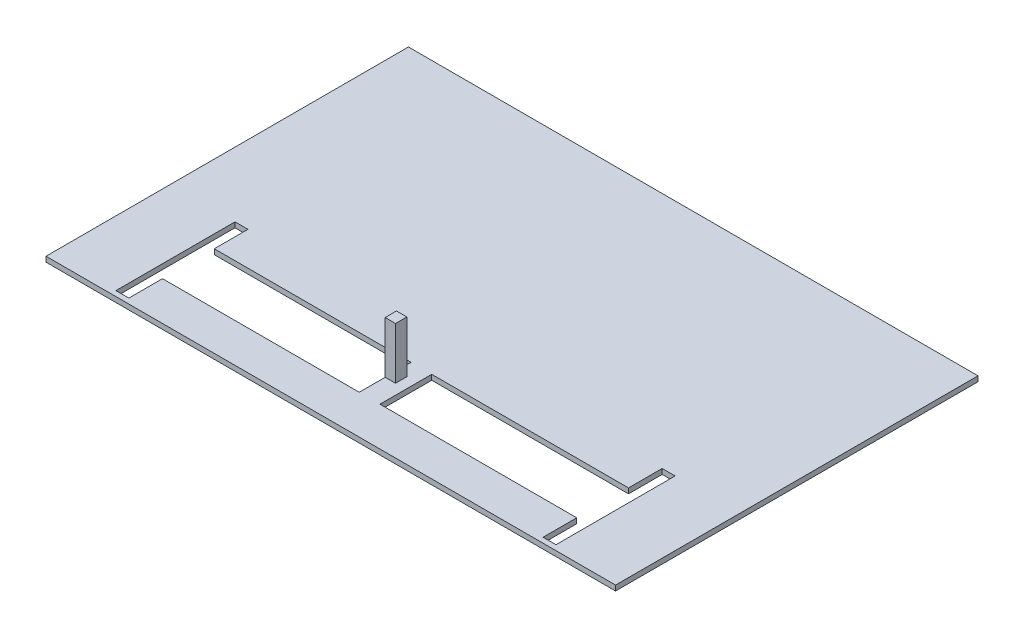
ISO-10303-21;
HEADER;
FILE_DESCRIPTION(('STEP AP214'),'2;1');
FILE_NAME('part.step','',(''),(''),'','','');
FILE_SCHEMA(('AUTOMOTIVE_DESIGN { 1 0 10303 214 1 1 1 1 }'));
ENDSEC;
DATA;
#1=APPLICATION_CONTEXT('core data for automotive mechanical design processes');
#2=APPLICATION_PROTOCOL_DEFINITION('international standard','automotive_design',2000,#1);
#3=PRODUCT_CONTEXT('',#1,'mechanical');
#4=PRODUCT('Part','Part','',(#3));
#5=PRODUCT_RELATED_PRODUCT_CATEGORY('part','',(#4));
#6=PRODUCT_DEFINITION_FORMATION('','',#4);
#7=PRODUCT_DEFINITION_CONTEXT('part definition',#1,'design');
#8=PRODUCT_DEFINITION('design','',#6,#7);
#9=PRODUCT_DEFINITION_SHAPE('','',#8);
#10=(LENGTH_UNIT() NAMED_UNIT(*) SI_UNIT(.MILLI.,.METRE.));
#11=(NAMED_UNIT(*) PLANE_ANGLE_UNIT() SI_UNIT($,.RADIAN.));
#12=(NAMED_UNIT(*) SI_UNIT($,.STERADIAN.) SOLID_ANGLE_UNIT());
#13=UNCERTAINTY_MEASURE_WITH_UNIT(LENGTH_MEASURE(1.E-05),#10,'distance_accuracy_value','');
#14=(GEOMETRIC_REPRESENTATION_CONTEXT(3) GLOBAL_UNCERTAINTY_ASSIGNED_CONTEXT((#13)) GLOBAL_UNIT_ASSIGNED_CONTEXT((#10,
#11,#12)) REPRESENTATION_CONTEXT('',''));
#15=CARTESIAN_POINT('',(0.,0.,0.));
#16=DIRECTION('',(0.,0.,1.));
#17=DIRECTION('',(1.,0.,0.));
#18=AXIS2_PLACEMENT_3D('',#15,#16,#17);
#19=CARTESIAN_POINT('',(80.,2.,35.));
#20=DIRECTION('',(0.,0.,1.));
#21=DIRECTION('',(1.,0.,0.));
#22=AXIS2_PLACEMENT_3D('',#19,#20,#21);
#23=PLANE('',#22);
#24=DIRECTION('',(-1.,0.,0.));
#25=VECTOR('',#24,1.);
#26=CARTESIAN_POINT('',(80.,0.,35.));
#27=LINE('',#26,#25);
#28=CARTESIAN_POINT('',(-3.99999999999999,0.,35.));
#29=VERTEX_POINT('',#28);
#30=CARTESIAN_POINT('',(-80.,0.,35.));
#31=VERTEX_POINT('',#30);
#32=EDGE_CURVE('E240',#29,#31,#27,.T.);
#33=ORIENTED_EDGE('',*,*,#32,.F.);
#34=DIRECTION('',(0.,-1.,0.));
#35=VECTOR('',#34,1.);
#36=CARTESIAN_POINT('',(-3.99999999999999,2.,35.0000000000001));
#37=LINE('',#36,#35);
#38=CARTESIAN_POINT('',(-3.99999999999999,2.,35.0000000000001));
#39=VERTEX_POINT('',#38);
#40=EDGE_CURVE('E226',#39,#29,#37,.T.);
#41=ORIENTED_EDGE('',*,*,#40,.F.);
#42=DIRECTION('',(-1.,0.,0.));
#43=VECTOR('',#42,1.);
#44=CARTESIAN_POINT('',(80.,2.,35.));
#45=LINE('',#44,#43);
#46=CARTESIAN_POINT('',(-80.,2.,35.));
#47=VERTEX_POINT('',#46);
#48=EDGE_CURVE('E245',#39,#47,#45,.T.);
#49=ORIENTED_EDGE('',*,*,#48,.T.);
#50=DIRECTION('',(0.,-1.,0.));
#51=VECTOR('',#50,1.);
#52=CARTESIAN_POINT('',(-80.,2.,35.));
#53=LINE('',#52,#51);
#54=EDGE_CURVE('E331',#47,#31,#53,.T.);
#55=ORIENTED_EDGE('',*,*,#54,.T.);
#56=EDGE_LOOP('',(#33,#41,#49,#55));
#57=FACE_BOUND('',#56,.T.);
#58=ADVANCED_FACE('F33',(#57),#23,.T.);
#59=CARTESIAN_POINT('',(80.,2.,35.));
#60=VERTEX_POINT('',#59);
#61=CARTESIAN_POINT('',(4.00000000000001,2.,35.0000000000001));
#62=VERTEX_POINT('',#61);
#63=EDGE_CURVE('E241',#60,#62,#45,.T.);
#64=ORIENTED_EDGE('',*,*,#63,.T.);
#65=DIRECTION('',(0.,-1.,0.));
#66=VECTOR('',#65,1.);
#67=CARTESIAN_POINT('',(4.00000000000001,2.,35.0000000000001));
#68=LINE('',#67,#66);
#69=CARTESIAN_POINT('',(4.00000000000001,0.,35.0000000000001));
#70=VERTEX_POINT('',#69);
#71=EDGE_CURVE('E231',#62,#70,#68,.T.);
#72=ORIENTED_EDGE('',*,*,#71,.T.);
#73=CARTESIAN_POINT('',(80.,0.,35.));
#74=VERTEX_POINT('',#73);
#75=EDGE_CURVE('E271',#74,#70,#27,.T.);
#76=ORIENTED_EDGE('',*,*,#75,.F.);
#77=DIRECTION('',(0.,-1.,0.));
#78=VECTOR('',#77,1.);
#79=CARTESIAN_POINT('',(80.,2.,35.));
#80=LINE('',#79,#78);
#81=EDGE_CURVE('E270',#60,#74,#80,.T.);
#82=ORIENTED_EDGE('',*,*,#81,.F.);
#83=EDGE_LOOP('',(#64,#72,#76,#82));
#84=FACE_BOUND('',#83,.T.);
#85=ADVANCED_FACE('F388',(#84),#23,.T.);
#86=CARTESIAN_POINT('',(80.,2.,55.));
#87=DIRECTION('',(0.,0.,-1.));
#88=DIRECTION('',(-1.,0.,0.));
#89=AXIS2_PLACEMENT_3D('',#86,#87,#88);
#90=PLANE('',#89);
#91=DIRECTION('',(1.,0.,0.));
#92=VECTOR('',#91,1.);
#93=CARTESIAN_POINT('',(80.,2.,55.));
#94=LINE('',#93,#92);
#95=CARTESIAN_POINT('',(-80.,2.,55.));
#96=VERTEX_POINT('',#95);
#97=CARTESIAN_POINT('',(-3.99999999999999,2.,55.0000000000001));
#98=VERTEX_POINT('',#97);
#99=EDGE_CURVE('E256',#96,#98,#94,.T.);
#100=ORIENTED_EDGE('',*,*,#99,.T.);
#101=DIRECTION('',(0.,-1.,0.));
#102=VECTOR('',#101,1.);
#103=CARTESIAN_POINT('',(-3.99999999999999,2.,55.0000000000001));
#104=LINE('',#103,#102);
#105=CARTESIAN_POINT('',(-3.99999999999999,0.,55.0000000000001));
#106=VERTEX_POINT('',#105);
#107=EDGE_CURVE('E237',#98,#106,#104,.T.);
#108=ORIENTED_EDGE('',*,*,#107,.T.);
#109=DIRECTION('',(1.,0.,0.));
#110=VECTOR('',#109,1.);
#111=CARTESIAN_POINT('',(80.,0.,55.));
#112=LINE('',#111,#110);
#113=CARTESIAN_POINT('',(-80.,0.,55.));
#114=VERTEX_POINT('',#113);
#115=EDGE_CURVE('E290',#114,#106,#112,.T.);
#116=ORIENTED_EDGE('',*,*,#115,.F.);
#117=DIRECTION('',(0.,-1.,0.));
#118=VECTOR('',#117,1.);
#119=CARTESIAN_POINT('',(-80.,2.,55.));
#120=LINE('',#119,#118);
#121=EDGE_CURVE('E321',#96,#114,#120,.T.);
#122=ORIENTED_EDGE('',*,*,#121,.F.);
#123=EDGE_LOOP('',(#100,#108,#116,#122));
#124=FACE_BOUND('',#123,.T.);
#125=ADVANCED_FACE('F395',(#124),#90,.T.);
#126=CARTESIAN_POINT('',(4.,0.,55.));
#127=VERTEX_POINT('',#126);
#128=CARTESIAN_POINT('',(80.,0.,55.));
#129=VERTEX_POINT('',#128);
#130=EDGE_CURVE('E289',#127,#129,#112,.T.);
#131=ORIENTED_EDGE('',*,*,#130,.F.);
#132=DIRECTION('',(0.,-1.,0.));
#133=VECTOR('',#132,1.);
#134=CARTESIAN_POINT('',(4.00000000000001,2.,55.0000000000001));
#135=LINE('',#134,#133);
#136=CARTESIAN_POINT('',(4.00000000000001,2.,55.0000000000001));
#137=VERTEX_POINT('',#136);
#138=EDGE_CURVE('E234',#137,#127,#135,.T.);
#139=ORIENTED_EDGE('',*,*,#138,.F.);
#140=CARTESIAN_POINT('',(80.,2.,55.));
#141=VERTEX_POINT('',#140);
#142=EDGE_CURVE('E255',#137,#141,#94,.T.);
#143=ORIENTED_EDGE('',*,*,#142,.T.);
#144=DIRECTION('',(0.,-1.,0.));
#145=VECTOR('',#144,1.);
#146=CARTESIAN_POINT('',(80.,2.,55.));
#147=LINE('',#146,#145);
#148=EDGE_CURVE('E318',#141,#129,#147,.T.);
#149=ORIENTED_EDGE('',*,*,#148,.T.);
#150=EDGE_LOOP('',(#131,#139,#143,#149));
#151=FACE_BOUND('',#150,.T.);
#152=ADVANCED_FACE('F404',(#151),#90,.T.);
#153=CARTESIAN_POINT('',(0.,2.,0.));
#154=DIRECTION('',(0.,1.,0.));
#155=DIRECTION('',(0.,0.,1.));
#156=AXIS2_PLACEMENT_3D('',#153,#154,#155);
#157=PLANE('',#156);
#158=DIRECTION('',(1.,0.,0.));
#159=VECTOR('',#158,1.);
#160=CARTESIAN_POINT('',(0.,2.,45.0000000000001));
#161=LINE('',#160,#159);
#162=CARTESIAN_POINT('',(-3.99999999999999,2.,45.0000000000001));
#163=VERTEX_POINT('',#162);
#164=CARTESIAN_POINT('',(0.,2.,45.0000000000001));
#165=VERTEX_POINT('',#164);
#166=EDGE_CURVE('E211',#163,#165,#161,.T.);
#167=ORIENTED_EDGE('',*,*,#166,.F.);
#168=DIRECTION('',(0.,0.,1.));
#169=VECTOR('',#168,1.);
#170=CARTESIAN_POINT('',(-3.99999999999999,2.,55.0000000000001));
#171=LINE('',#170,#169);
#172=EDGE_CURVE('E225',#163,#98,#171,.T.);
#173=ORIENTED_EDGE('',*,*,#172,.T.);
#174=ORIENTED_EDGE('',*,*,#99,.F.);
#175=DIRECTION('',(0.,0.,-1.));
#176=VECTOR('',#175,1.);
#177=CARTESIAN_POINT('',(-80.,2.,55.));
#178=LINE('',#177,#176);
#179=CARTESIAN_POINT('',(-80.,2.,68.));
#180=VERTEX_POINT('',#179);
#181=EDGE_CURVE('E253',#180,#96,#178,.T.);
#182=ORIENTED_EDGE('',*,*,#181,.F.);
#183=DIRECTION('',(1.,0.,0.));
#184=VECTOR('',#183,1.);
#185=CARTESIAN_POINT('',(-80.,2.,68.));
#186=LINE('',#185,#184);
#187=CARTESIAN_POINT('',(-85.,2.,68.));
#188=VERTEX_POINT('',#187);
#189=EDGE_CURVE('E251',#188,#180,#186,.T.);
#190=ORIENTED_EDGE('',*,*,#189,.F.);
#191=DIRECTION('',(0.,0.,1.));
#192=VECTOR('',#191,1.);
#193=CARTESIAN_POINT('',(-85.,2.,22.));
#194=LINE('',#193,#192);
#195=CARTESIAN_POINT('',(-85.,2.,22.));
#196=VERTEX_POINT('',#195);
#197=EDGE_CURVE('E249',#196,#188,#194,.T.);
#198=ORIENTED_EDGE('',*,*,#197,.F.);
#199=DIRECTION('',(-1.,0.,0.));
#200=VECTOR('',#199,1.);
#201=CARTESIAN_POINT('',(-80.,2.,22.));
#202=LINE('',#201,#200);
#203=CARTESIAN_POINT('',(-80.,2.,22.));
#204=VERTEX_POINT('',#203);
#205=EDGE_CURVE('E247',#204,#196,#202,.T.);
#206=ORIENTED_EDGE('',*,*,#205,.F.);
#207=DIRECTION('',(0.,0.,-1.));
#208=VECTOR('',#207,1.);
#209=CARTESIAN_POINT('',(-80.,2.,35.));
#210=LINE('',#209,#208);
#211=EDGE_CURVE('E244',#47,#204,#210,.T.);
#212=ORIENTED_EDGE('',*,*,#211,.F.);
#213=ORIENTED_EDGE('',*,*,#48,.F.);
#214=CARTESIAN_POINT('',(-3.99999999999999,2.,40.6187513861027));
#215=VERTEX_POINT('',#214);
#216=EDGE_CURVE('E222',#39,#215,#171,.T.);
#217=ORIENTED_EDGE('',*,*,#216,.T.);
#218=DIRECTION('',(-1.,0.,0.));
#219=VECTOR('',#218,1.);
#220=CARTESIAN_POINT('',(0.,2.,40.6187513861027));
#221=LINE('',#220,#219);
#222=CARTESIAN_POINT('',(0.,2.,40.6187513861027));
#223=VERTEX_POINT('',#222);
#224=EDGE_CURVE('E53',#223,#215,#221,.T.);
#225=ORIENTED_EDGE('',*,*,#224,.F.);
#226=DIRECTION('',(0.,0.,-1.));
#227=VECTOR('',#226,1.);
#228=CARTESIAN_POINT('',(0.,2.,45.0000000000001));
#229=LINE('',#228,#227);
#230=EDGE_CURVE('E48',#165,#223,#229,.T.);
#231=ORIENTED_EDGE('',*,*,#230,.F.);
#232=EDGE_LOOP('',(#167,#173,#174,#182,#190,#198,#206,#212,#213,#217,#225,#231));
#233=FACE_BOUND('',#232,.T.);
#234=DIRECTION('',(0.,0.,1.));
#235=VECTOR('',#234,1.);
#236=CARTESIAN_POINT('',(-110.,2.,70.0000000000001));
#237=LINE('',#236,#235);
#238=CARTESIAN_POINT('',(-110.,2.,-69.9999999999999));
#239=VERTEX_POINT('',#238);
#240=CARTESIAN_POINT('',(-110.,2.,70.0000000000001));
#241=VERTEX_POINT('',#240);
#242=EDGE_CURVE('E335',#239,#241,#237,.T.);
#243=ORIENTED_EDGE('',*,*,#242,.T.);
#244=DIRECTION('',(1.,0.,0.));
#245=VECTOR('',#244,1.);
#246=CARTESIAN_POINT('',(110.,2.,70.0000000000001));
#247=LINE('',#246,#245);
#248=CARTESIAN_POINT('',(110.,2.,70.0000000000001));
#249=VERTEX_POINT('',#248);
#250=EDGE_CURVE('E338',#241,#249,#247,.T.);
#251=ORIENTED_EDGE('',*,*,#250,.T.);
#252=DIRECTION('',(0.,0.,-1.));
#253=VECTOR('',#252,1.);
#254=CARTESIAN_POINT('',(110.,2.,70.0000000000001));
#255=LINE('',#254,#253);
#256=CARTESIAN_POINT('',(110.,2.,-70.));
#257=VERTEX_POINT('',#256);
#258=EDGE_CURVE('E341',#249,#257,#255,.T.);
#259=ORIENTED_EDGE('',*,*,#258,.T.);
#260=DIRECTION('',(-1.,0.,0.));
#261=VECTOR('',#260,1.);
#262=CARTESIAN_POINT('',(110.,2.,-70.));
#263=LINE('',#262,#261);
#264=EDGE_CURVE('E343',#257,#239,#263,.T.);
#265=ORIENTED_EDGE('',*,*,#264,.T.);
#266=EDGE_LOOP('',(#243,#251,#259,#265));
#267=FACE_BOUND('',#266,.T.);
#268=DIRECTION('',(0.,0.,-1.));
#269=VECTOR('',#268,1.);
#270=CARTESIAN_POINT('',(4.00000000000001,2.,55.0000000000001));
#271=LINE('',#270,#269);
#272=EDGE_CURVE('E224',#137,#62,#271,.T.);
#273=ORIENTED_EDGE('',*,*,#272,.T.);
#274=ORIENTED_EDGE('',*,*,#63,.F.);
#275=DIRECTION('',(0.,0.,1.));
#276=VECTOR('',#275,1.);
#277=CARTESIAN_POINT('',(80.,2.,35.));
#278=LINE('',#277,#276);
#279=CARTESIAN_POINT('',(80.0000000000001,2.,22.));
#280=VERTEX_POINT('',#279);
#281=EDGE_CURVE('E268',#280,#60,#278,.T.);
#282=ORIENTED_EDGE('',*,*,#281,.F.);
#283=DIRECTION('',(-1.,0.,0.));
#284=VECTOR('',#283,1.);
#285=CARTESIAN_POINT('',(80.0000000000001,2.,22.));
#286=LINE('',#285,#284);
#287=CARTESIAN_POINT('',(85.0000000000001,2.,22.));
#288=VERTEX_POINT('',#287);
#289=EDGE_CURVE('E265',#288,#280,#286,.T.);
#290=ORIENTED_EDGE('',*,*,#289,.F.);
#291=DIRECTION('',(0.,0.,-1.));
#292=VECTOR('',#291,1.);
#293=CARTESIAN_POINT('',(85.0000000000001,2.,22.));
#294=LINE('',#293,#292);
#295=CARTESIAN_POINT('',(85.0000000000001,2.,68.));
#296=VERTEX_POINT('',#295);
#297=EDGE_CURVE('E263',#296,#288,#294,.T.);
#298=ORIENTED_EDGE('',*,*,#297,.F.);
#299=DIRECTION('',(1.,0.,0.));
#300=VECTOR('',#299,1.);
#301=CARTESIAN_POINT('',(80.0000000000001,2.,68.));
#302=LINE('',#301,#300);
#303=CARTESIAN_POINT('',(80.0000000000001,2.,68.));
#304=VERTEX_POINT('',#303);
#305=EDGE_CURVE('E261',#304,#296,#302,.T.);
#306=ORIENTED_EDGE('',*,*,#305,.F.);
#307=DIRECTION('',(0.,0.,1.));
#308=VECTOR('',#307,1.);
#309=CARTESIAN_POINT('',(80.,2.,55.));
#310=LINE('',#309,#308);
#311=EDGE_CURVE('E259',#141,#304,#310,.T.);
#312=ORIENTED_EDGE('',*,*,#311,.F.);
#313=ORIENTED_EDGE('',*,*,#142,.F.);
#314=EDGE_LOOP('',(#273,#274,#282,#290,#298,#306,#312,#313));
#315=FACE_BOUND('',#314,.T.);
#316=ADVANCED_FACE('F378',(#233,#267,#315),#157,.T.);
#317=CARTESIAN_POINT('',(0.,0.,0.));
#318=DIRECTION('',(0.,1.,0.));
#319=DIRECTION('',(0.,0.,1.));
#320=AXIS2_PLACEMENT_3D('',#317,#318,#319);
#321=PLANE('',#320);
#322=DIRECTION('',(0.,0.,1.));
#323=VECTOR('',#322,1.);
#324=CARTESIAN_POINT('',(-3.99999999999999,0.,55.0000000000001));
#325=LINE('',#324,#323);
#326=EDGE_CURVE('E214',#29,#106,#325,.T.);
#327=ORIENTED_EDGE('',*,*,#326,.F.);
#328=ORIENTED_EDGE('',*,*,#32,.T.);
#329=DIRECTION('',(0.,0.,-1.));
#330=VECTOR('',#329,1.);
#331=CARTESIAN_POINT('',(-80.,0.,35.));
#332=LINE('',#331,#330);
#333=CARTESIAN_POINT('',(-80.,0.,22.));
#334=VERTEX_POINT('',#333);
#335=EDGE_CURVE('E274',#31,#334,#332,.T.);
#336=ORIENTED_EDGE('',*,*,#335,.T.);
#337=DIRECTION('',(-1.,0.,0.));
#338=VECTOR('',#337,1.);
#339=CARTESIAN_POINT('',(-80.,0.,22.));
#340=LINE('',#339,#338);
#341=CARTESIAN_POINT('',(-85.,0.,22.));
#342=VERTEX_POINT('',#341);
#343=EDGE_CURVE('E277',#334,#342,#340,.T.);
#344=ORIENTED_EDGE('',*,*,#343,.T.);
#345=DIRECTION('',(0.,0.,1.));
#346=VECTOR('',#345,1.);
#347=CARTESIAN_POINT('',(-85.,0.,22.));
#348=LINE('',#347,#346);
#349=CARTESIAN_POINT('',(-85.,0.,68.));
#350=VERTEX_POINT('',#349);
#351=EDGE_CURVE('E280',#342,#350,#348,.T.);
#352=ORIENTED_EDGE('',*,*,#351,.T.);
#353=DIRECTION('',(1.,0.,0.));
#354=VECTOR('',#353,1.);
#355=CARTESIAN_POINT('',(-80.,0.,68.));
#356=LINE('',#355,#354);
#357=CARTESIAN_POINT('',(-80.,0.,68.));
#358=VERTEX_POINT('',#357);
#359=EDGE_CURVE('E283',#350,#358,#356,.T.);
#360=ORIENTED_EDGE('',*,*,#359,.T.);
#361=DIRECTION('',(0.,0.,-1.));
#362=VECTOR('',#361,1.);
#363=CARTESIAN_POINT('',(-80.,0.,55.));
#364=LINE('',#363,#362);
#365=EDGE_CURVE('E286',#358,#114,#364,.T.);
#366=ORIENTED_EDGE('',*,*,#365,.T.);
#367=ORIENTED_EDGE('',*,*,#115,.T.);
#368=EDGE_LOOP('',(#327,#328,#336,#344,#352,#360,#366,#367));
#369=FACE_BOUND('',#368,.T.);
#370=DIRECTION('',(0.,0.,1.));
#371=VECTOR('',#370,1.);
#372=CARTESIAN_POINT('',(-110.,0.,70.0000000000001));
#373=LINE('',#372,#371);
#374=CARTESIAN_POINT('',(-110.,0.,-69.9999999999999));
#375=VERTEX_POINT('',#374);
#376=CARTESIAN_POINT('',(-110.,0.,70.0000000000001));
#377=VERTEX_POINT('',#376);
#378=EDGE_CURVE('E334',#375,#377,#373,.T.);
#379=ORIENTED_EDGE('',*,*,#378,.F.);
#380=DIRECTION('',(-1.,0.,0.));
#381=VECTOR('',#380,1.);
#382=CARTESIAN_POINT('',(110.,0.,-70.));
#383=LINE('',#382,#381);
#384=CARTESIAN_POINT('',(110.,0.,-70.));
#385=VERTEX_POINT('',#384);
#386=EDGE_CURVE('E339',#385,#375,#383,.T.);
#387=ORIENTED_EDGE('',*,*,#386,.F.);
#388=DIRECTION('',(0.,0.,-1.));
#389=VECTOR('',#388,1.);
#390=CARTESIAN_POINT('',(110.,0.,70.0000000000001));
#391=LINE('',#390,#389);
#392=CARTESIAN_POINT('',(110.,0.,70.0000000000001));
#393=VERTEX_POINT('',#392);
#394=EDGE_CURVE('E350',#393,#385,#391,.T.);
#395=ORIENTED_EDGE('',*,*,#394,.F.);
#396=DIRECTION('',(1.,0.,0.));
#397=VECTOR('',#396,1.);
#398=CARTESIAN_POINT('',(110.,0.,70.0000000000001));
#399=LINE('',#398,#397);
#400=EDGE_CURVE('E348',#377,#393,#399,.T.);
#401=ORIENTED_EDGE('',*,*,#400,.F.);
#402=EDGE_LOOP('',(#379,#387,#395,#401));
#403=FACE_BOUND('',#402,.T.);
#404=ORIENTED_EDGE('',*,*,#75,.T.);
#405=DIRECTION('',(0.,0.,-1.));
#406=VECTOR('',#405,1.);
#407=CARTESIAN_POINT('',(4.00000000000001,0.,55.0000000000001));
#408=LINE('',#407,#406);
#409=EDGE_CURVE('E216',#127,#70,#408,.T.);
#410=ORIENTED_EDGE('',*,*,#409,.F.);
#411=ORIENTED_EDGE('',*,*,#130,.T.);
#412=DIRECTION('',(0.,0.,1.));
#413=VECTOR('',#412,1.);
#414=CARTESIAN_POINT('',(80.,0.,55.));
#415=LINE('',#414,#413);
#416=CARTESIAN_POINT('',(80.0000000000001,0.,68.));
#417=VERTEX_POINT('',#416);
#418=EDGE_CURVE('E293',#129,#417,#415,.T.);
#419=ORIENTED_EDGE('',*,*,#418,.T.);
#420=DIRECTION('',(1.,0.,0.));
#421=VECTOR('',#420,1.);
#422=CARTESIAN_POINT('',(80.0000000000001,0.,68.));
#423=LINE('',#422,#421);
#424=CARTESIAN_POINT('',(85.0000000000001,0.,68.));
#425=VERTEX_POINT('',#424);
#426=EDGE_CURVE('E296',#417,#425,#423,.T.);
#427=ORIENTED_EDGE('',*,*,#426,.T.);
#428=DIRECTION('',(0.,0.,-1.));
#429=VECTOR('',#428,1.);
#430=CARTESIAN_POINT('',(85.0000000000001,0.,22.));
#431=LINE('',#430,#429);
#432=CARTESIAN_POINT('',(85.0000000000001,0.,22.));
#433=VERTEX_POINT('',#432);
#434=EDGE_CURVE('E299',#425,#433,#431,.T.);
#435=ORIENTED_EDGE('',*,*,#434,.T.);
#436=DIRECTION('',(-1.,0.,0.));
#437=VECTOR('',#436,1.);
#438=CARTESIAN_POINT('',(80.0000000000001,0.,22.));
#439=LINE('',#438,#437);
#440=CARTESIAN_POINT('',(80.0000000000001,0.,22.));
#441=VERTEX_POINT('',#440);
#442=EDGE_CURVE('E302',#433,#441,#439,.T.);
#443=ORIENTED_EDGE('',*,*,#442,.T.);
#444=DIRECTION('',(0.,0.,1.));
#445=VECTOR('',#444,1.);
#446=CARTESIAN_POINT('',(80.,0.,35.));
#447=LINE('',#446,#445);
#448=EDGE_CURVE('E305',#441,#74,#447,.T.);
#449=ORIENTED_EDGE('',*,*,#448,.T.);
#450=EDGE_LOOP('',(#404,#410,#411,#419,#427,#435,#443,#449));
#451=FACE_BOUND('',#450,.T.);
#452=ADVANCED_FACE('F368',(#369,#403,#451),#321,.F.);
#453=CARTESIAN_POINT('',(-110.,2.,70.0000000000001));
#454=DIRECTION('',(1.,0.,0.));
#455=DIRECTION('',(0.,0.,-1.));
#456=AXIS2_PLACEMENT_3D('',#453,#454,#455);
#457=PLANE('',#456);
#458=ORIENTED_EDGE('',*,*,#378,.T.);
#459=DIRECTION('',(0.,-1.,0.));
#460=VECTOR('',#459,1.);
#461=CARTESIAN_POINT('',(-110.,2.,70.0000000000001));
#462=LINE('',#461,#460);
#463=EDGE_CURVE('E11',#241,#377,#462,.T.);
#464=ORIENTED_EDGE('',*,*,#463,.F.);
#465=ORIENTED_EDGE('',*,*,#242,.F.);
#466=DIRECTION('',(0.,-1.,0.));
#467=VECTOR('',#466,1.);
#468=CARTESIAN_POINT('',(-110.,2.,-69.9999999999999));
#469=LINE('',#468,#467);
#470=EDGE_CURVE('E345',#239,#375,#469,.T.);
#471=ORIENTED_EDGE('',*,*,#470,.T.);
#472=EDGE_LOOP('',(#458,#464,#465,#471));
#473=FACE_BOUND('',#472,.T.);
#474=ADVANCED_FACE('F35',(#473),#457,.F.);
#475=CARTESIAN_POINT('',(110.,2.,70.0000000000001));
#476=DIRECTION('',(0.,0.,-1.));
#477=DIRECTION('',(-1.,0.,0.));
#478=AXIS2_PLACEMENT_3D('',#475,#476,#477);
#479=PLANE('',#478);
#480=ORIENTED_EDGE('',*,*,#400,.T.);
#481=DIRECTION('',(0.,-1.,0.));
#482=VECTOR('',#481,1.);
#483=CARTESIAN_POINT('',(110.,2.,70.0000000000001));
#484=LINE('',#483,#482);
#485=EDGE_CURVE('E41',#249,#393,#484,.T.);
#486=ORIENTED_EDGE('',*,*,#485,.F.);
#487=ORIENTED_EDGE('',*,*,#250,.F.);
#488=ORIENTED_EDGE('',*,*,#463,.T.);
#489=EDGE_LOOP('',(#480,#486,#487,#488));
#490=FACE_BOUND('',#489,.T.);
#491=ADVANCED_FACE('F380',(#490),#479,.F.);
#492=CARTESIAN_POINT('',(110.,2.,70.0000000000001));
#493=DIRECTION('',(-1.,0.,0.));
#494=DIRECTION('',(0.,0.,1.));
#495=AXIS2_PLACEMENT_3D('',#492,#493,#494);
#496=PLANE('',#495);
#497=ORIENTED_EDGE('',*,*,#394,.T.);
#498=DIRECTION('',(0.,-1.,0.));
#499=VECTOR('',#498,1.);
#500=CARTESIAN_POINT('',(110.,2.,-70.));
#501=LINE('',#500,#499);
#502=EDGE_CURVE('E355',#257,#385,#501,.T.);
#503=ORIENTED_EDGE('',*,*,#502,.F.);
#504=ORIENTED_EDGE('',*,*,#258,.F.);
#505=ORIENTED_EDGE('',*,*,#485,.T.);
#506=EDGE_LOOP('',(#497,#503,#504,#505));
#507=FACE_BOUND('',#506,.T.);
#508=ADVANCED_FACE('F362',(#507),#496,.F.);
#509=CARTESIAN_POINT('',(110.,2.,-70.));
#510=DIRECTION('',(0.,0.,1.));
#511=DIRECTION('',(1.,0.,0.));
#512=AXIS2_PLACEMENT_3D('',#509,#510,#511);
#513=PLANE('',#512);
#514=ORIENTED_EDGE('',*,*,#386,.T.);
#515=ORIENTED_EDGE('',*,*,#470,.F.);
#516=ORIENTED_EDGE('',*,*,#264,.F.);
#517=ORIENTED_EDGE('',*,*,#502,.T.);
#518=EDGE_LOOP('',(#514,#515,#516,#517));
#519=FACE_BOUND('',#518,.T.);
#520=ADVANCED_FACE('F372',(#519),#513,.F.);
#521=CARTESIAN_POINT('',(-80.,2.,35.));
#522=DIRECTION('',(-1.,0.,0.));
#523=DIRECTION('',(0.,0.,1.));
#524=AXIS2_PLACEMENT_3D('',#521,#522,#523);
#525=PLANE('',#524);
#526=ORIENTED_EDGE('',*,*,#335,.F.);
#527=ORIENTED_EDGE('',*,*,#54,.F.);
#528=ORIENTED_EDGE('',*,*,#211,.T.);
#529=DIRECTION('',(0.,-1.,0.));
#530=VECTOR('',#529,1.);
#531=CARTESIAN_POINT('',(-80.,2.,22.));
#532=LINE('',#531,#530);
#533=EDGE_CURVE('E329',#204,#334,#532,.T.);
#534=ORIENTED_EDGE('',*,*,#533,.T.);
#535=EDGE_LOOP('',(#526,#527,#528,#534));
#536=FACE_BOUND('',#535,.T.);
#537=ADVANCED_FACE('F400',(#536),#525,.T.);
#538=CARTESIAN_POINT('',(-80.,2.,22.));
#539=DIRECTION('',(0.,0.,1.));
#540=DIRECTION('',(1.,0.,0.));
#541=AXIS2_PLACEMENT_3D('',#538,#539,#540);
#542=PLANE('',#541);
#543=ORIENTED_EDGE('',*,*,#343,.F.);
#544=ORIENTED_EDGE('',*,*,#533,.F.);
#545=ORIENTED_EDGE('',*,*,#205,.T.);
#546=DIRECTION('',(0.,-1.,0.));
#547=VECTOR('',#546,1.);
#548=CARTESIAN_POINT('',(-85.,2.,22.));
#549=LINE('',#548,#547);
#550=EDGE_CURVE('E327',#196,#342,#549,.T.);
#551=ORIENTED_EDGE('',*,*,#550,.T.);
#552=EDGE_LOOP('',(#543,#544,#545,#551));
#553=FACE_BOUND('',#552,.T.);
#554=ADVANCED_FACE('F412',(#553),#542,.T.);
#555=CARTESIAN_POINT('',(-85.,2.,22.));
#556=DIRECTION('',(1.,0.,0.));
#557=DIRECTION('',(0.,0.,-1.));
#558=AXIS2_PLACEMENT_3D('',#555,#556,#557);
#559=PLANE('',#558);
#560=ORIENTED_EDGE('',*,*,#351,.F.);
#561=ORIENTED_EDGE('',*,*,#550,.F.);
#562=ORIENTED_EDGE('',*,*,#197,.T.);
#563=DIRECTION('',(0.,-1.,0.));
#564=VECTOR('',#563,1.);
#565=CARTESIAN_POINT('',(-85.,2.,68.));
#566=LINE('',#565,#564);
#567=EDGE_CURVE('E325',#188,#350,#566,.T.);
#568=ORIENTED_EDGE('',*,*,#567,.T.);
#569=EDGE_LOOP('',(#560,#561,#562,#568));
#570=FACE_BOUND('',#569,.T.);
#571=ADVANCED_FACE('F417',(#570),#559,.T.);
#572=CARTESIAN_POINT('',(-80.,2.,68.));
#573=DIRECTION('',(0.,0.,-1.));
#574=DIRECTION('',(-1.,0.,0.));
#575=AXIS2_PLACEMENT_3D('',#572,#573,#574);
#576=PLANE('',#575);
#577=ORIENTED_EDGE('',*,*,#359,.F.);
#578=ORIENTED_EDGE('',*,*,#567,.F.);
#579=ORIENTED_EDGE('',*,*,#189,.T.);
#580=DIRECTION('',(0.,-1.,0.));
#581=VECTOR('',#580,1.);
#582=CARTESIAN_POINT('',(-80.,2.,68.));
#583=LINE('',#582,#581);
#584=EDGE_CURVE('E323',#180,#358,#583,.T.);
#585=ORIENTED_EDGE('',*,*,#584,.T.);
#586=EDGE_LOOP('',(#577,#578,#579,#585));
#587=FACE_BOUND('',#586,.T.);
#588=ADVANCED_FACE('F435',(#587),#576,.T.);
#589=CARTESIAN_POINT('',(-80.,2.,55.));
#590=DIRECTION('',(-1.,0.,0.));
#591=DIRECTION('',(0.,0.,1.));
#592=AXIS2_PLACEMENT_3D('',#589,#590,#591);
#593=PLANE('',#592);
#594=ORIENTED_EDGE('',*,*,#365,.F.);
#595=ORIENTED_EDGE('',*,*,#584,.F.);
#596=ORIENTED_EDGE('',*,*,#181,.T.);
#597=ORIENTED_EDGE('',*,*,#121,.T.);
#598=EDGE_LOOP('',(#594,#595,#596,#597));
#599=FACE_BOUND('',#598,.T.);
#600=ADVANCED_FACE('F440',(#599),#593,.T.);
#601=CARTESIAN_POINT('',(80.,2.,55.));
#602=DIRECTION('',(1.,0.,0.));
#603=DIRECTION('',(0.,0.,-1.));
#604=AXIS2_PLACEMENT_3D('',#601,#602,#603);
#605=PLANE('',#604);
#606=ORIENTED_EDGE('',*,*,#418,.F.);
#607=ORIENTED_EDGE('',*,*,#148,.F.);
#608=ORIENTED_EDGE('',*,*,#311,.T.);
#609=DIRECTION('',(0.,-1.,0.));
#610=VECTOR('',#609,1.);
#611=CARTESIAN_POINT('',(80.0000000000001,2.,68.));
#612=LINE('',#611,#610);
#613=EDGE_CURVE('E316',#304,#417,#612,.T.);
#614=ORIENTED_EDGE('',*,*,#613,.T.);
#615=EDGE_LOOP('',(#606,#607,#608,#614));
#616=FACE_BOUND('',#615,.T.);
#617=ADVANCED_FACE('F492',(#616),#605,.T.);
#618=CARTESIAN_POINT('',(80.0000000000001,2.,68.));
#619=DIRECTION('',(0.,0.,-1.));
#620=DIRECTION('',(-1.,0.,0.));
#621=AXIS2_PLACEMENT_3D('',#618,#619,#620);
#622=PLANE('',#621);
#623=ORIENTED_EDGE('',*,*,#426,.F.);
#624=ORIENTED_EDGE('',*,*,#613,.F.);
#625=ORIENTED_EDGE('',*,*,#305,.T.);
#626=DIRECTION('',(0.,-1.,0.));
#627=VECTOR('',#626,1.);
#628=CARTESIAN_POINT('',(85.0000000000001,2.,68.));
#629=LINE('',#628,#627);
#630=EDGE_CURVE('E314',#296,#425,#629,.T.);
#631=ORIENTED_EDGE('',*,*,#630,.T.);
#632=EDGE_LOOP('',(#623,#624,#625,#631));
#633=FACE_BOUND('',#632,.T.);
#634=ADVANCED_FACE('F488',(#633),#622,.T.);
#635=CARTESIAN_POINT('',(85.0000000000001,2.,22.));
#636=DIRECTION('',(-1.,0.,0.));
#637=DIRECTION('',(0.,0.,1.));
#638=AXIS2_PLACEMENT_3D('',#635,#636,#637);
#639=PLANE('',#638);
#640=ORIENTED_EDGE('',*,*,#434,.F.);
#641=ORIENTED_EDGE('',*,*,#630,.F.);
#642=ORIENTED_EDGE('',*,*,#297,.T.);
#643=DIRECTION('',(0.,-1.,0.));
#644=VECTOR('',#643,1.);
#645=CARTESIAN_POINT('',(85.0000000000001,2.,22.));
#646=LINE('',#645,#644);
#647=EDGE_CURVE('E312',#288,#433,#646,.T.);
#648=ORIENTED_EDGE('',*,*,#647,.T.);
#649=EDGE_LOOP('',(#640,#641,#642,#648));
#650=FACE_BOUND('',#649,.T.);
#651=ADVANCED_FACE('F484',(#650),#639,.T.);
#652=CARTESIAN_POINT('',(80.0000000000001,2.,22.));
#653=DIRECTION('',(0.,0.,1.));
#654=DIRECTION('',(1.,0.,0.));
#655=AXIS2_PLACEMENT_3D('',#652,#653,#654);
#656=PLANE('',#655);
#657=ORIENTED_EDGE('',*,*,#442,.F.);
#658=ORIENTED_EDGE('',*,*,#647,.F.);
#659=ORIENTED_EDGE('',*,*,#289,.T.);
#660=DIRECTION('',(0.,-1.,0.));
#661=VECTOR('',#660,1.);
#662=CARTESIAN_POINT('',(80.0000000000001,2.,22.));
#663=LINE('',#662,#661);
#664=EDGE_CURVE('E310',#280,#441,#663,.T.);
#665=ORIENTED_EDGE('',*,*,#664,.T.);
#666=EDGE_LOOP('',(#657,#658,#659,#665));
#667=FACE_BOUND('',#666,.T.);
#668=ADVANCED_FACE('F480',(#667),#656,.T.);
#669=CARTESIAN_POINT('',(80.,2.,35.));
#670=DIRECTION('',(1.,0.,0.));
#671=DIRECTION('',(0.,0.,-1.));
#672=AXIS2_PLACEMENT_3D('',#669,#670,#671);
#673=PLANE('',#672);
#674=ORIENTED_EDGE('',*,*,#448,.F.);
#675=ORIENTED_EDGE('',*,*,#664,.F.);
#676=ORIENTED_EDGE('',*,*,#281,.T.);
#677=ORIENTED_EDGE('',*,*,#81,.T.);
#678=EDGE_LOOP('',(#674,#675,#676,#677));
#679=FACE_BOUND('',#678,.T.);
#680=ADVANCED_FACE('F477',(#679),#673,.T.);
#681=CARTESIAN_POINT('',(-3.99999999999999,2.,55.0000000000001));
#682=DIRECTION('',(1.,0.,0.));
#683=DIRECTION('',(0.,0.,-1.));
#684=AXIS2_PLACEMENT_3D('',#681,#682,#683);
#685=PLANE('',#684);
#686=ORIENTED_EDGE('',*,*,#326,.T.);
#687=ORIENTED_EDGE('',*,*,#107,.F.);
#688=ORIENTED_EDGE('',*,*,#172,.F.);
#689=DIRECTION('',(0.,-1.,0.));
#690=VECTOR('',#689,1.);
#691=CARTESIAN_POINT('',(-3.99999999999999,22.,45.0000000000001));
#692=LINE('',#691,#690);
#693=CARTESIAN_POINT('',(-3.99999999999999,22.,45.0000000000001));
#694=VERTEX_POINT('',#693);
#695=EDGE_CURVE('E218',#694,#163,#692,.T.);
#696=ORIENTED_EDGE('',*,*,#695,.F.);
#697=DIRECTION('',(0.,0.,1.));
#698=VECTOR('',#697,1.);
#699=CARTESIAN_POINT('',(-3.99999999999999,22.,45.0000000000001));
#700=LINE('',#699,#698);
#701=CARTESIAN_POINT('',(-3.99999999999999,22.,40.6187513861027));
#702=VERTEX_POINT('',#701);
#703=EDGE_CURVE('E201',#702,#694,#700,.T.);
#704=ORIENTED_EDGE('',*,*,#703,.F.);
#705=DIRECTION('',(0.,-1.,0.));
#706=VECTOR('',#705,1.);
#707=CARTESIAN_POINT('',(-3.99999999999999,22.,40.6187513861027));
#708=LINE('',#707,#706);
#709=EDGE_CURVE('E198',#702,#215,#708,.T.);
#710=ORIENTED_EDGE('',*,*,#709,.T.);
#711=ORIENTED_EDGE('',*,*,#216,.F.);
#712=ORIENTED_EDGE('',*,*,#40,.T.);
#713=EDGE_LOOP('',(#686,#687,#688,#696,#704,#710,#711,#712));
#714=FACE_BOUND('',#713,.T.);
#715=ADVANCED_FACE('F448',(#714),#685,.F.);
#716=CARTESIAN_POINT('',(4.00000000000001,2.,55.0000000000001));
#717=DIRECTION('',(-1.,0.,0.));
#718=DIRECTION('',(0.,0.,1.));
#719=AXIS2_PLACEMENT_3D('',#716,#717,#718);
#720=PLANE('',#719);
#721=ORIENTED_EDGE('',*,*,#409,.T.);
#722=ORIENTED_EDGE('',*,*,#71,.F.);
#723=ORIENTED_EDGE('',*,*,#272,.F.);
#724=ORIENTED_EDGE('',*,*,#138,.T.);
#725=EDGE_LOOP('',(#721,#722,#723,#724));
#726=FACE_BOUND('',#725,.T.);
#727=ADVANCED_FACE('F471',(#726),#720,.F.);
#728=CARTESIAN_POINT('',(0.,22.,45.0000000000001));
#729=DIRECTION('',(-1.,0.,0.));
#730=DIRECTION('',(0.,0.,1.));
#731=AXIS2_PLACEMENT_3D('',#728,#729,#730);
#732=PLANE('',#731);
#733=ORIENTED_EDGE('',*,*,#230,.T.);
#734=DIRECTION('',(0.,-1.,0.));
#735=VECTOR('',#734,1.);
#736=CARTESIAN_POINT('',(0.,22.,40.6187513861027));
#737=LINE('',#736,#735);
#738=CARTESIAN_POINT('',(0.,22.,40.6187513861027));
#739=VERTEX_POINT('',#738);
#740=EDGE_CURVE('E196',#739,#223,#737,.T.);
#741=ORIENTED_EDGE('',*,*,#740,.F.);
#742=DIRECTION('',(0.,0.,-1.));
#743=VECTOR('',#742,1.);
#744=CARTESIAN_POINT('',(0.,22.,45.0000000000001));
#745=LINE('',#744,#743);
#746=CARTESIAN_POINT('',(0.,22.,45.0000000000001));
#747=VERTEX_POINT('',#746);
#748=EDGE_CURVE('E202',#747,#739,#745,.T.);
#749=ORIENTED_EDGE('',*,*,#748,.F.);
#750=DIRECTION('',(0.,-1.,0.));
#751=VECTOR('',#750,1.);
#752=CARTESIAN_POINT('',(0.,22.,45.0000000000001));
#753=LINE('',#752,#751);
#754=EDGE_CURVE('E452',#747,#165,#753,.T.);
#755=ORIENTED_EDGE('',*,*,#754,.T.);
#756=EDGE_LOOP('',(#733,#741,#749,#755));
#757=FACE_BOUND('',#756,.T.);
#758=ADVANCED_FACE('F213',(#757),#732,.F.);
#759=CARTESIAN_POINT('',(0.,22.,40.6187513861027));
#760=DIRECTION('',(0.,0.,1.));
#761=DIRECTION('',(1.,0.,0.));
#762=AXIS2_PLACEMENT_3D('',#759,#760,#761);
#763=PLANE('',#762);
#764=ORIENTED_EDGE('',*,*,#224,.T.);
#765=ORIENTED_EDGE('',*,*,#709,.F.);
#766=DIRECTION('',(-1.,0.,0.));
#767=VECTOR('',#766,1.);
#768=CARTESIAN_POINT('',(0.,22.,40.6187513861027));
#769=LINE('',#768,#767);
#770=EDGE_CURVE('E192',#739,#702,#769,.T.);
#771=ORIENTED_EDGE('',*,*,#770,.F.);
#772=ORIENTED_EDGE('',*,*,#740,.T.);
#773=EDGE_LOOP('',(#764,#765,#771,#772));
#774=FACE_BOUND('',#773,.T.);
#775=ADVANCED_FACE('F194',(#774),#763,.F.);
#776=CARTESIAN_POINT('',(0.,22.,45.0000000000001));
#777=DIRECTION('',(0.,0.,-1.));
#778=DIRECTION('',(-1.,0.,0.));
#779=AXIS2_PLACEMENT_3D('',#776,#777,#778);
#780=PLANE('',#779);
#781=ORIENTED_EDGE('',*,*,#166,.T.);
#782=ORIENTED_EDGE('',*,*,#754,.F.);
#783=DIRECTION('',(1.,0.,0.));
#784=VECTOR('',#783,1.);
#785=CARTESIAN_POINT('',(0.,22.,45.0000000000001));
#786=LINE('',#785,#784);
#787=EDGE_CURVE('E207',#694,#747,#786,.T.);
#788=ORIENTED_EDGE('',*,*,#787,.F.);
#789=ORIENTED_EDGE('',*,*,#695,.T.);
#790=EDGE_LOOP('',(#781,#782,#788,#789));
#791=FACE_BOUND('',#790,.T.);
#792=ADVANCED_FACE('F459',(#791),#780,.F.);
#793=CARTESIAN_POINT('',(0.,22.,0.));
#794=DIRECTION('',(0.,1.,0.));
#795=DIRECTION('',(0.,0.,1.));
#796=AXIS2_PLACEMENT_3D('',#793,#794,#795);
#797=PLANE('',#796);
#798=ORIENTED_EDGE('',*,*,#748,.T.);
#799=ORIENTED_EDGE('',*,*,#770,.T.);
#800=ORIENTED_EDGE('',*,*,#703,.T.);
#801=ORIENTED_EDGE('',*,*,#787,.T.);
#802=EDGE_LOOP('',(#798,#799,#800,#801));
#803=FACE_BOUND('',#802,.T.);
#804=ADVANCED_FACE('F205',(#803),#797,.T.);
#805=CLOSED_SHELL('',(#58,#85,#125,#152,#316,#452,#474,#491,#508,#520,#537,#554,#571,#588,#600,
#617,#634,#651,#668,#680,#715,#727,#758,#775,#792,#804));
#806=MANIFOLD_SOLID_BREP('B2',#805);
#807=ADVANCED_BREP_SHAPE_REPRESENTATION('',(#18,#806),#14);
#808=SHAPE_DEFINITION_REPRESENTATION(#9,#807);
ENDSEC;
END-ISO-10303-21;
